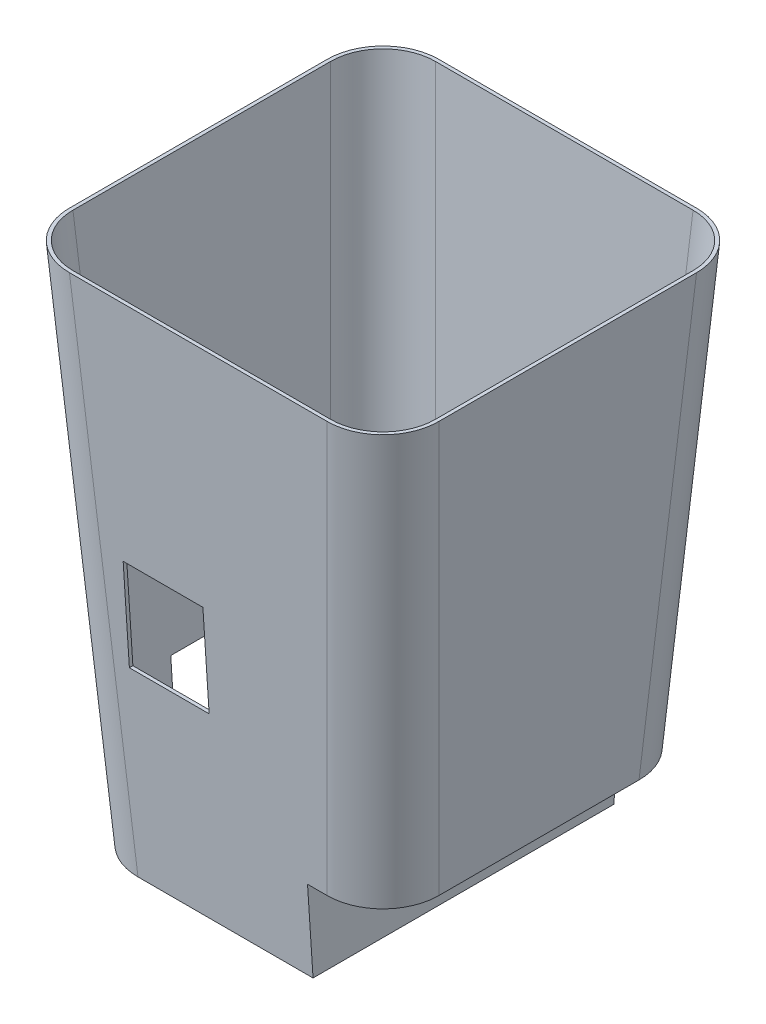
ISO-10303-21;
HEADER;
FILE_DESCRIPTION(('STEP AP214'),'2;1');
FILE_NAME('part.step','',(''),(''),'','','');
FILE_SCHEMA(('AUTOMOTIVE_DESIGN { 1 0 10303 214 1 1 1 1 }'));
ENDSEC;
DATA;
#1=APPLICATION_CONTEXT('core data for automotive mechanical design processes');
#2=APPLICATION_PROTOCOL_DEFINITION('international standard','automotive_design',2000,#1);
#3=PRODUCT_CONTEXT('',#1,'mechanical');
#4=PRODUCT('Part','Part','',(#3));
#5=PRODUCT_RELATED_PRODUCT_CATEGORY('part','',(#4));
#6=PRODUCT_DEFINITION_FORMATION('','',#4);
#7=PRODUCT_DEFINITION_CONTEXT('part definition',#1,'design');
#8=PRODUCT_DEFINITION('design','',#6,#7);
#9=PRODUCT_DEFINITION_SHAPE('','',#8);
#10=(LENGTH_UNIT() NAMED_UNIT(*) SI_UNIT(.MILLI.,.METRE.));
#11=(NAMED_UNIT(*) PLANE_ANGLE_UNIT() SI_UNIT($,.RADIAN.));
#12=(NAMED_UNIT(*) SI_UNIT($,.STERADIAN.) SOLID_ANGLE_UNIT());
#13=UNCERTAINTY_MEASURE_WITH_UNIT(LENGTH_MEASURE(1.E-05),#10,'distance_accuracy_value','');
#14=(GEOMETRIC_REPRESENTATION_CONTEXT(3) GLOBAL_UNCERTAINTY_ASSIGNED_CONTEXT((#13)) GLOBAL_UNIT_ASSIGNED_CONTEXT((#10,
#11,#12)) REPRESENTATION_CONTEXT('',''));
#15=CARTESIAN_POINT('',(0.,0.,0.));
#16=DIRECTION('',(0.,0.,1.));
#17=DIRECTION('',(1.,0.,0.));
#18=AXIS2_PLACEMENT_3D('',#15,#16,#17);
#19=CARTESIAN_POINT('',(0.,-17.8105348768919,271.883267100311));
#20=DIRECTION('',(0.,0.0653679148444921,-0.997861230687355));
#21=DIRECTION('',(0.,0.997861230687355,0.0653679148444922));
#22=AXIS2_PLACEMENT_3D('',#19,#20,#21);
#23=PLANE('',#22);
#24=DIRECTION('',(1.,0.,0.));
#25=VECTOR('',#24,1.);
#26=CARTESIAN_POINT('',(0.,152.4,283.033422459893));
#27=LINE('',#26,#25);
#28=CARTESIAN_POINT('',(146.05,152.4,283.033422459893));
#29=VERTEX_POINT('',#28);
#30=CARTESIAN_POINT('',(181.650721422058,152.4,283.033422459893));
#31=VERTEX_POINT('',#30);
#32=EDGE_CURVE('E544',#29,#31,#27,.T.);
#33=ORIENTED_EDGE('',*,*,#32,.T.);
#34=DIRECTION('',(0.0652287034370434,0.995736125936909,0.0652287034370431));
#35=VECTOR('',#34,1.);
#36=CARTESIAN_POINT('',(169.775123024273,-28.8846449294553,271.157824062108));
#37=LINE('',#36,#35);
#38=CARTESIAN_POINT('',(233.897298962165,949.96,335.28));
#39=VERTEX_POINT('',#38);
#40=EDGE_CURVE('E470',#31,#39,#37,.T.);
#41=ORIENTED_EDGE('',*,*,#40,.T.);
#42=DIRECTION('',(1.,0.,0.));
#43=VECTOR('',#42,1.);
#44=CARTESIAN_POINT('',(335.28,949.96,335.28));
#45=LINE('',#44,#43);
#46=CARTESIAN_POINT('',(-233.897298962165,949.96,335.28));
#47=VERTEX_POINT('',#46);
#48=EDGE_CURVE('E553',#47,#39,#45,.T.);
#49=ORIENTED_EDGE('',*,*,#48,.F.);
#50=DIRECTION('',(-0.0652287034370435,0.995736125936909,0.0652287034370432));
#51=VECTOR('',#50,1.);
#52=CARTESIAN_POINT('',(-169.775123024273,-28.8846449294553,271.157824062108));
#53=LINE('',#52,#51);
#54=CARTESIAN_POINT('',(-171.667298962165,0.,273.05));
#55=VERTEX_POINT('',#54);
#56=EDGE_CURVE('E608',#47,#55,#53,.F.);
#57=ORIENTED_EDGE('',*,*,#56,.T.);
#58=DIRECTION('',(1.,0.,0.));
#59=VECTOR('',#58,1.);
#60=CARTESIAN_POINT('',(273.05,0.,273.05));
#61=LINE('',#60,#59);
#62=CARTESIAN_POINT('',(146.05,0.,273.05));
#63=VERTEX_POINT('',#62);
#64=EDGE_CURVE('E546',#55,#63,#61,.T.);
#65=ORIENTED_EDGE('',*,*,#64,.T.);
#66=DIRECTION('',(0.,0.997861230687355,0.0653679148444922));
#67=VECTOR('',#66,1.);
#68=CARTESIAN_POINT('',(146.05,-17.8105348768919,271.883267100311));
#69=LINE('',#68,#67);
#70=EDGE_CURVE('E643',#63,#29,#69,.T.);
#71=ORIENTED_EDGE('',*,*,#70,.T.);
#72=EDGE_LOOP('',(#33,#41,#49,#57,#65,#71));
#73=FACE_BOUND('',#72,.T.);
#74=DIRECTION('',(0.,-0.997861230687355,-0.0653679148444922));
#75=VECTOR('',#74,1.);
#76=CARTESIAN_POINT('',(-164.7952,-17.810534876892,271.883267100311));
#77=LINE('',#76,#75);
#78=CARTESIAN_POINT('',(-164.7952,516.5725,306.889642379679));
#79=VERTEX_POINT('',#78);
#80=CARTESIAN_POINT('',(-164.7952,343.535,295.554298128342));
#81=VERTEX_POINT('',#80);
#82=EDGE_CURVE('E290',#79,#81,#77,.T.);
#83=ORIENTED_EDGE('',*,*,#82,.F.);
#84=DIRECTION('',(-1.,0.,0.));
#85=VECTOR('',#84,1.);
#86=CARTESIAN_POINT('',(0.,516.5725,306.889642379679));
#87=LINE('',#86,#85);
#88=CARTESIAN_POINT('',(-20.0151999999999,516.5725,306.889642379679));
#89=VERTEX_POINT('',#88);
#90=EDGE_CURVE('E280',#89,#79,#87,.T.);
#91=ORIENTED_EDGE('',*,*,#90,.F.);
#92=DIRECTION('',(0.,0.997861230687355,0.0653679148444922));
#93=VECTOR('',#92,1.);
#94=CARTESIAN_POINT('',(-20.0151999999998,-17.8105348768919,271.883267100311));
#95=LINE('',#94,#93);
#96=CARTESIAN_POINT('',(-20.0151999999999,343.535,295.554298128342));
#97=VERTEX_POINT('',#96);
#98=EDGE_CURVE('E283',#97,#89,#95,.T.);
#99=ORIENTED_EDGE('',*,*,#98,.F.);
#100=DIRECTION('',(1.,0.,0.));
#101=VECTOR('',#100,1.);
#102=CARTESIAN_POINT('',(0.,343.535,295.554298128342));
#103=LINE('',#102,#101);
#104=EDGE_CURVE('E287',#81,#97,#103,.T.);
#105=ORIENTED_EDGE('',*,*,#104,.F.);
#106=EDGE_LOOP('',(#83,#91,#99,#105));
#107=FACE_BOUND('',#106,.T.);
#108=ADVANCED_FACE('F55',(#73,#107),#23,.F.);
#109=CARTESIAN_POINT('',(0.,-17.3954486176294,265.546848285446));
#110=DIRECTION('',(0.,0.0653679148444921,-0.997861230687355));
#111=DIRECTION('',(0.,0.997861230687355,0.0653679148444922));
#112=AXIS2_PLACEMENT_3D('',#109,#110,#111);
#113=PLANE('',#112);
#114=DIRECTION('',(1.,0.,0.));
#115=VECTOR('',#114,1.);
#116=CARTESIAN_POINT('',(0.,158.75,277.085788101307));
#117=LINE('',#116,#115);
#118=CARTESIAN_POINT('',(139.7,158.75,277.085788101307));
#119=VERTEX_POINT('',#118);
#120=CARTESIAN_POINT('',(182.039505878336,158.75,277.085788101307));
#121=VERTEX_POINT('',#120);
#122=EDGE_CURVE('E343',#119,#121,#117,.T.);
#123=ORIENTED_EDGE('',*,*,#122,.F.);
#124=DIRECTION('',(0.,0.997861230687355,0.0653679148444922));
#125=VECTOR('',#124,1.);
#126=CARTESIAN_POINT('',(139.7,-17.3954486176294,265.546848285446));
#127=LINE('',#126,#125);
#128=CARTESIAN_POINT('',(139.7,6.35,267.102365641414));
#129=VERTEX_POINT('',#128);
#130=EDGE_CURVE('E338',#129,#119,#127,.T.);
#131=ORIENTED_EDGE('',*,*,#130,.F.);
#132=DIRECTION('',(1.,0.,0.));
#133=VECTOR('',#132,1.);
#134=CARTESIAN_POINT('',(0.,6.35,267.102365641414));
#135=LINE('',#134,#133);
#136=CARTESIAN_POINT('',(-172.056083418443,6.35,267.102365641414));
#137=VERTEX_POINT('',#136);
#138=EDGE_CURVE('E294',#137,#129,#135,.T.);
#139=ORIENTED_EDGE('',*,*,#138,.F.);
#140=DIRECTION('',(-0.0652287034370435,0.995736125936909,0.0652287034370432));
#141=VECTOR('',#140,1.);
#142=CARTESIAN_POINT('',(-169.775123024273,-28.4695586701928,264.821405247243));
#143=LINE('',#142,#141);
#144=CARTESIAN_POINT('',(-233.870107482614,949.96,328.916389705584));
#145=VERTEX_POINT('',#144);
#146=EDGE_CURVE('E342',#145,#137,#143,.F.);
#147=ORIENTED_EDGE('',*,*,#146,.F.);
#148=DIRECTION('',(1.,0.,0.));
#149=VECTOR('',#148,1.);
#150=CARTESIAN_POINT('',(0.,949.96,328.916389705584));
#151=LINE('',#150,#149);
#152=CARTESIAN_POINT('',(233.870107482614,949.96,328.916389705584));
#153=VERTEX_POINT('',#152);
#154=EDGE_CURVE('E383',#145,#153,#151,.T.);
#155=ORIENTED_EDGE('',*,*,#154,.T.);
#156=DIRECTION('',(0.0652287034370434,0.995736125936909,0.0652287034370431));
#157=VECTOR('',#156,1.);
#158=CARTESIAN_POINT('',(169.775123024273,-28.4695586701928,264.821405247243));
#159=LINE('',#158,#157);
#160=EDGE_CURVE('E348',#121,#153,#159,.T.);
#161=ORIENTED_EDGE('',*,*,#160,.F.);
#162=EDGE_LOOP('',(#123,#131,#139,#147,#155,#161));
#163=FACE_BOUND('',#162,.T.);
#164=DIRECTION('',(-1.,0.,0.));
#165=VECTOR('',#164,1.);
#166=CARTESIAN_POINT('',(0.,516.5725,300.526032085264));
#167=LINE('',#166,#165);
#168=CARTESIAN_POINT('',(-20.0151999999999,516.5725,300.526032085264));
#169=VERTEX_POINT('',#168);
#170=CARTESIAN_POINT('',(-164.7952,516.5725,300.526032085264));
#171=VERTEX_POINT('',#170);
#172=EDGE_CURVE('E965',#169,#171,#167,.T.);
#173=ORIENTED_EDGE('',*,*,#172,.T.);
#174=DIRECTION('',(0.,-0.997861230687355,-0.0653679148444922));
#175=VECTOR('',#174,1.);
#176=CARTESIAN_POINT('',(-164.7952,-17.3954486176294,265.546848285446));
#177=LINE('',#176,#175);
#178=CARTESIAN_POINT('',(-164.7952,343.535,289.190687833927));
#179=VERTEX_POINT('',#178);
#180=EDGE_CURVE('E1002',#171,#179,#177,.T.);
#181=ORIENTED_EDGE('',*,*,#180,.T.);
#182=DIRECTION('',(1.,0.,0.));
#183=VECTOR('',#182,1.);
#184=CARTESIAN_POINT('',(0.,343.535,289.190687833927));
#185=LINE('',#184,#183);
#186=CARTESIAN_POINT('',(-20.0151999999999,343.535,289.190687833927));
#187=VERTEX_POINT('',#186);
#188=EDGE_CURVE('E1007',#179,#187,#185,.T.);
#189=ORIENTED_EDGE('',*,*,#188,.T.);
#190=DIRECTION('',(0.,0.997861230687355,0.0653679148444922));
#191=VECTOR('',#190,1.);
#192=CARTESIAN_POINT('',(-20.0151999999998,-17.3954486176294,265.546848285446));
#193=LINE('',#192,#191);
#194=EDGE_CURVE('E1013',#187,#169,#193,.T.);
#195=ORIENTED_EDGE('',*,*,#194,.T.);
#196=EDGE_LOOP('',(#173,#181,#189,#195));
#197=FACE_BOUND('',#196,.T.);
#198=ADVANCED_FACE('F577',(#163,#197),#113,.T.);
#199=CARTESIAN_POINT('',(0.,949.96,0.));
#200=DIRECTION('',(0.,-1.,0.));
#201=DIRECTION('',(0.,0.,-1.));
#202=AXIS2_PLACEMENT_3D('',#199,#200,#201);
#203=PLANE('',#202);
#204=ORIENTED_EDGE('',*,*,#154,.F.);
#205=CARTESIAN_POINT('',(-233.462235289355,949.96,233.462235289355));
#206=DIRECTION('',(0.,-1.,0.));
#207=DIRECTION('',(-0.707106781186549,0.,0.707106781186546));
#208=AXIS2_PLACEMENT_3D('',#205,#206,#207);
#209=ELLIPSE('',#208,95.6578731241445,95.25);
#210=CARTESIAN_POINT('',(-328.916389705585,949.96,233.870107482614));
#211=VERTEX_POINT('',#210);
#212=EDGE_CURVE('E380',#211,#145,#209,.F.);
#213=ORIENTED_EDGE('',*,*,#212,.F.);
#214=DIRECTION('',(0.,0.,1.));
#215=VECTOR('',#214,1.);
#216=CARTESIAN_POINT('',(-328.916389705585,949.96,0.));
#217=LINE('',#216,#215);
#218=CARTESIAN_POINT('',(-328.916389705585,949.96,-233.870107482614));
#219=VERTEX_POINT('',#218);
#220=EDGE_CURVE('E314',#219,#211,#217,.T.);
#221=ORIENTED_EDGE('',*,*,#220,.F.);
#222=CARTESIAN_POINT('',(-233.462235289355,949.96,-233.462235289355));
#223=DIRECTION('',(0.,-1.,0.));
#224=DIRECTION('',(-0.707106781186547,0.,-0.707106781186549));
#225=AXIS2_PLACEMENT_3D('',#222,#223,#224);
#226=ELLIPSE('',#225,95.6578731241445,95.25);
#227=CARTESIAN_POINT('',(-233.870107482614,949.96,-328.916389705585));
#228=VERTEX_POINT('',#227);
#229=EDGE_CURVE('E351',#228,#219,#226,.F.);
#230=ORIENTED_EDGE('',*,*,#229,.F.);
#231=DIRECTION('',(-1.,0.,0.));
#232=VECTOR('',#231,1.);
#233=CARTESIAN_POINT('',(0.,949.96,-328.916389705585));
#234=LINE('',#233,#232);
#235=CARTESIAN_POINT('',(233.870107482614,949.96,-328.916389705585));
#236=VERTEX_POINT('',#235);
#237=EDGE_CURVE('E347',#236,#228,#234,.T.);
#238=ORIENTED_EDGE('',*,*,#237,.F.);
#239=CARTESIAN_POINT('',(233.462235289355,949.96,-233.462235289355));
#240=DIRECTION('',(0.,-1.,0.));
#241=DIRECTION('',(0.707106781186546,0.,-0.707106781186549));
#242=AXIS2_PLACEMENT_3D('',#239,#240,#241);
#243=ELLIPSE('',#242,95.6578731241445,95.25);
#244=CARTESIAN_POINT('',(328.916389705585,949.96,-233.870107482614));
#245=VERTEX_POINT('',#244);
#246=EDGE_CURVE('E386',#245,#236,#243,.F.);
#247=ORIENTED_EDGE('',*,*,#246,.F.);
#248=DIRECTION('',(0.,0.,-1.));
#249=VECTOR('',#248,1.);
#250=CARTESIAN_POINT('',(328.916389705585,949.96,0.));
#251=LINE('',#250,#249);
#252=CARTESIAN_POINT('',(328.916389705585,949.96,233.870107482614));
#253=VERTEX_POINT('',#252);
#254=EDGE_CURVE('E377',#253,#245,#251,.T.);
#255=ORIENTED_EDGE('',*,*,#254,.F.);
#256=CARTESIAN_POINT('',(233.462235289355,949.96,233.462235289355));
#257=DIRECTION('',(0.,-1.,0.));
#258=DIRECTION('',(0.707106781186549,0.,0.707106781186546));
#259=AXIS2_PLACEMENT_3D('',#256,#257,#258);
#260=ELLIPSE('',#259,95.6578731241445,95.25);
#261=EDGE_CURVE('E368',#153,#253,#260,.F.);
#262=ORIENTED_EDGE('',*,*,#261,.F.);
#263=EDGE_LOOP('',(#204,#213,#221,#230,#238,#247,#255,#262));
#264=FACE_BOUND('',#263,.T.);
#265=ORIENTED_EDGE('',*,*,#48,.T.);
#266=CARTESIAN_POINT('',(233.462235289355,949.96,233.462235289355));
#267=DIRECTION('',(0.,-1.,0.));
#268=DIRECTION('',(0.707106781186549,0.,0.707106781186546));
#269=AXIS2_PLACEMENT_3D('',#266,#267,#268);
#270=ELLIPSE('',#269,102.035064665754,101.6);
#271=CARTESIAN_POINT('',(335.28,949.96,233.897298962164));
#272=VERTEX_POINT('',#271);
#273=EDGE_CURVE('E480',#39,#272,#270,.F.);
#274=ORIENTED_EDGE('',*,*,#273,.T.);
#275=DIRECTION('',(0.,0.,-1.));
#276=VECTOR('',#275,1.);
#277=CARTESIAN_POINT('',(335.28,949.96,-335.28));
#278=LINE('',#277,#276);
#279=CARTESIAN_POINT('',(335.28,949.96,-233.897298962165));
#280=VERTEX_POINT('',#279);
#281=EDGE_CURVE('E545',#272,#280,#278,.T.);
#282=ORIENTED_EDGE('',*,*,#281,.T.);
#283=CARTESIAN_POINT('',(233.462235289355,949.96,-233.462235289355));
#284=DIRECTION('',(0.,-1.,0.));
#285=DIRECTION('',(0.707106781186546,0.,-0.707106781186549));
#286=AXIS2_PLACEMENT_3D('',#283,#284,#285);
#287=ELLIPSE('',#286,102.035064665754,101.6);
#288=CARTESIAN_POINT('',(233.897298962164,949.96,-335.28));
#289=VERTEX_POINT('',#288);
#290=EDGE_CURVE('E475',#280,#289,#287,.F.);
#291=ORIENTED_EDGE('',*,*,#290,.T.);
#292=DIRECTION('',(-1.,0.,0.));
#293=VECTOR('',#292,1.);
#294=CARTESIAN_POINT('',(335.28,949.96,-335.28));
#295=LINE('',#294,#293);
#296=CARTESIAN_POINT('',(-233.897298962165,949.96,-335.28));
#297=VERTEX_POINT('',#296);
#298=EDGE_CURVE('E462',#289,#297,#295,.T.);
#299=ORIENTED_EDGE('',*,*,#298,.T.);
#300=CARTESIAN_POINT('',(-233.462235289355,949.96,-233.462235289355));
#301=DIRECTION('',(0.,-1.,0.));
#302=DIRECTION('',(-0.707106781186547,0.,-0.707106781186549));
#303=AXIS2_PLACEMENT_3D('',#300,#301,#302);
#304=ELLIPSE('',#303,102.035064665754,101.6);
#305=CARTESIAN_POINT('',(-335.28,949.96,-233.897298962165));
#306=VERTEX_POINT('',#305);
#307=EDGE_CURVE('E466',#297,#306,#304,.F.);
#308=ORIENTED_EDGE('',*,*,#307,.T.);
#309=DIRECTION('',(0.,0.,1.));
#310=VECTOR('',#309,1.);
#311=CARTESIAN_POINT('',(-335.28,949.96,-335.28));
#312=LINE('',#311,#310);
#313=CARTESIAN_POINT('',(-335.28,949.96,233.897298962164));
#314=VERTEX_POINT('',#313);
#315=EDGE_CURVE('E548',#306,#314,#312,.T.);
#316=ORIENTED_EDGE('',*,*,#315,.T.);
#317=CARTESIAN_POINT('',(-233.462235289355,949.96,233.462235289355));
#318=DIRECTION('',(0.,-1.,0.));
#319=DIRECTION('',(-0.707106781186549,0.,0.707106781186546));
#320=AXIS2_PLACEMENT_3D('',#317,#318,#319);
#321=ELLIPSE('',#320,102.035064665754,101.6);
#322=EDGE_CURVE('E469',#314,#47,#321,.F.);
#323=ORIENTED_EDGE('',*,*,#322,.T.);
#324=EDGE_LOOP('',(#265,#274,#282,#291,#299,#308,#316,#323));
#325=FACE_BOUND('',#324,.T.);
#326=ADVANCED_FACE('F568',(#264,#325),#203,.F.);
#327=CARTESIAN_POINT('',(0.,0.,0.));
#328=DIRECTION('',(0.,-1.,0.));
#329=DIRECTION('',(0.,0.,-1.));
#330=AXIS2_PLACEMENT_3D('',#327,#328,#329);
#331=PLANE('',#330);
#332=ORIENTED_EDGE('',*,*,#64,.F.);
#333=CARTESIAN_POINT('',(-171.232235289355,0.,171.232235289355));
#334=DIRECTION('',(0.,-1.,0.));
#335=DIRECTION('',(-0.707106781186549,0.,0.707106781186546));
#336=AXIS2_PLACEMENT_3D('',#333,#334,#335);
#337=ELLIPSE('',#336,102.035064665754,101.6);
#338=CARTESIAN_POINT('',(-273.05,0.,171.667298962165));
#339=VERTEX_POINT('',#338);
#340=EDGE_CURVE('E955',#55,#339,#337,.T.);
#341=ORIENTED_EDGE('',*,*,#340,.T.);
#342=DIRECTION('',(0.,0.,1.));
#343=VECTOR('',#342,1.);
#344=CARTESIAN_POINT('',(-273.05,0.,-273.05));
#345=LINE('',#344,#343);
#346=CARTESIAN_POINT('',(-273.05,0.,-171.667298962165));
#347=VERTEX_POINT('',#346);
#348=EDGE_CURVE('E412',#347,#339,#345,.T.);
#349=ORIENTED_EDGE('',*,*,#348,.F.);
#350=CARTESIAN_POINT('',(-171.232235289355,0.,-171.232235289355));
#351=DIRECTION('',(0.,-1.,0.));
#352=DIRECTION('',(-0.707106781186547,0.,-0.707106781186549));
#353=AXIS2_PLACEMENT_3D('',#350,#351,#352);
#354=ELLIPSE('',#353,102.035064665754,101.6);
#355=CARTESIAN_POINT('',(-171.667298962165,0.,-273.05));
#356=VERTEX_POINT('',#355);
#357=EDGE_CURVE('E949',#347,#356,#354,.T.);
#358=ORIENTED_EDGE('',*,*,#357,.T.);
#359=DIRECTION('',(-1.,0.,0.));
#360=VECTOR('',#359,1.);
#361=CARTESIAN_POINT('',(273.05,0.,-273.05));
#362=LINE('',#361,#360);
#363=CARTESIAN_POINT('',(146.05,0.,-273.05));
#364=VERTEX_POINT('',#363);
#365=EDGE_CURVE('E554',#364,#356,#362,.T.);
#366=ORIENTED_EDGE('',*,*,#365,.F.);
#367=DIRECTION('',(0.,0.,1.));
#368=VECTOR('',#367,1.);
#369=CARTESIAN_POINT('',(146.05,0.,-335.2801));
#370=LINE('',#369,#368);
#371=EDGE_CURVE('E401',#364,#63,#370,.T.);
#372=ORIENTED_EDGE('',*,*,#371,.T.);
#373=EDGE_LOOP('',(#332,#341,#349,#358,#366,#372));
#374=FACE_BOUND('',#373,.T.);
#375=ADVANCED_FACE('F435',(#374),#331,.T.);
#376=CARTESIAN_POINT('',(0.,-17.8105348768921,-271.883267100311));
#377=DIRECTION('',(0.,0.0653679148444927,0.997861230687355));
#378=DIRECTION('',(0.,-0.997861230687355,0.0653679148444927));
#379=AXIS2_PLACEMENT_3D('',#376,#377,#378);
#380=PLANE('',#379);
#381=ORIENTED_EDGE('',*,*,#298,.F.);
#382=DIRECTION('',(0.0652287034370434,0.995736125936909,-0.0652287034370437));
#383=VECTOR('',#382,1.);
#384=CARTESIAN_POINT('',(169.775123024273,-28.8846449294554,-271.157824062108));
#385=LINE('',#384,#383);
#386=CARTESIAN_POINT('',(181.650721422058,152.4,-283.033422459893));
#387=VERTEX_POINT('',#386);
#388=EDGE_CURVE('E507',#289,#387,#385,.F.);
#389=ORIENTED_EDGE('',*,*,#388,.T.);
#390=DIRECTION('',(-1.,0.,0.));
#391=VECTOR('',#390,1.);
#392=CARTESIAN_POINT('',(0.,152.4,-283.033422459893));
#393=LINE('',#392,#391);
#394=CARTESIAN_POINT('',(146.05,152.4,-283.033422459893));
#395=VERTEX_POINT('',#394);
#396=EDGE_CURVE('E407',#387,#395,#393,.T.);
#397=ORIENTED_EDGE('',*,*,#396,.T.);
#398=DIRECTION('',(0.,-0.997861230687355,0.0653679148444927));
#399=VECTOR('',#398,1.);
#400=CARTESIAN_POINT('',(146.05,-17.8105348768921,-271.883267100311));
#401=LINE('',#400,#399);
#402=EDGE_CURVE('E408',#395,#364,#401,.T.);
#403=ORIENTED_EDGE('',*,*,#402,.T.);
#404=ORIENTED_EDGE('',*,*,#365,.T.);
#405=DIRECTION('',(-0.0652287034370435,0.995736125936909,-0.0652287034370437));
#406=VECTOR('',#405,1.);
#407=CARTESIAN_POINT('',(-169.775123024273,-28.8846449294555,-271.157824062108));
#408=LINE('',#407,#406);
#409=EDGE_CURVE('E504',#356,#297,#408,.T.);
#410=ORIENTED_EDGE('',*,*,#409,.T.);
#411=EDGE_LOOP('',(#381,#389,#397,#403,#404,#410));
#412=FACE_BOUND('',#411,.T.);
#413=ADVANCED_FACE('F424',(#412),#380,.F.);
#414=CARTESIAN_POINT('',(271.883267100311,-17.810534876892,0.));
#415=DIRECTION('',(-0.997861230687355,0.0653679148444924,0.));
#416=DIRECTION('',(-0.0653679148444924,-0.997861230687355,0.));
#417=AXIS2_PLACEMENT_3D('',#414,#415,#416);
#418=PLANE('',#417);
#419=ORIENTED_EDGE('',*,*,#281,.F.);
#420=DIRECTION('',(0.0652287034370434,0.995736125936909,0.0652287034370431));
#421=VECTOR('',#420,1.);
#422=CARTESIAN_POINT('',(271.157824062108,-28.8846449294553,169.775123024273));
#423=LINE('',#422,#421);
#424=CARTESIAN_POINT('',(283.033422459893,152.4,181.650721422058));
#425=VERTEX_POINT('',#424);
#426=EDGE_CURVE('E491',#272,#425,#423,.F.);
#427=ORIENTED_EDGE('',*,*,#426,.T.);
#428=DIRECTION('',(0.,0.,-1.));
#429=VECTOR('',#428,1.);
#430=CARTESIAN_POINT('',(283.033422459893,152.4,0.));
#431=LINE('',#430,#429);
#432=CARTESIAN_POINT('',(283.033422459893,152.4,-181.650721422058));
#433=VERTEX_POINT('',#432);
#434=EDGE_CURVE('E406',#425,#433,#431,.T.);
#435=ORIENTED_EDGE('',*,*,#434,.T.);
#436=DIRECTION('',(0.0652287034370434,0.995736125936909,-0.0652287034370437));
#437=VECTOR('',#436,1.);
#438=CARTESIAN_POINT('',(271.157824062108,-28.8846449294554,-169.775123024273));
#439=LINE('',#438,#437);
#440=EDGE_CURVE('E485',#433,#280,#439,.T.);
#441=ORIENTED_EDGE('',*,*,#440,.T.);
#442=EDGE_LOOP('',(#419,#427,#435,#441));
#443=FACE_BOUND('',#442,.T.);
#444=ADVANCED_FACE('F434',(#443),#418,.F.);
#445=CARTESIAN_POINT('',(-271.883267100311,-17.810534876892,0.));
#446=DIRECTION('',(0.997861230687355,0.0653679148444925,0.));
#447=DIRECTION('',(-0.0653679148444925,0.997861230687355,0.));
#448=AXIS2_PLACEMENT_3D('',#445,#446,#447);
#449=PLANE('',#448);
#450=DIRECTION('',(0.,0.,1.));
#451=VECTOR('',#450,1.);
#452=CARTESIAN_POINT('',(-286.777205882353,209.55,0.));
#453=LINE('',#452,#451);
#454=CARTESIAN_POINT('',(-286.777205882353,209.55,-104.775));
#455=VERTEX_POINT('',#454);
#456=CARTESIAN_POINT('',(-286.777205882353,209.55,104.775));
#457=VERTEX_POINT('',#456);
#458=EDGE_CURVE('E258',#455,#457,#453,.T.);
#459=ORIENTED_EDGE('',*,*,#458,.T.);
#460=DIRECTION('',(0.0653679148444925,-0.997861230687355,0.));
#461=VECTOR('',#460,1.);
#462=CARTESIAN_POINT('',(-271.883267100311,-17.810534876892,104.775));
#463=LINE('',#462,#461);
#464=CARTESIAN_POINT('',(-273.465975935829,6.34999999999995,104.775));
#465=VERTEX_POINT('',#464);
#466=EDGE_CURVE('E249',#457,#465,#463,.T.);
#467=ORIENTED_EDGE('',*,*,#466,.T.);
#468=DIRECTION('',(0.,0.,-1.));
#469=VECTOR('',#468,1.);
#470=CARTESIAN_POINT('',(-273.465975935829,6.34999999999996,0.));
#471=LINE('',#470,#469);
#472=CARTESIAN_POINT('',(-273.465975935829,6.34999999999996,-104.775));
#473=VERTEX_POINT('',#472);
#474=EDGE_CURVE('E237',#465,#473,#471,.T.);
#475=ORIENTED_EDGE('',*,*,#474,.T.);
#476=DIRECTION('',(-0.0653679148444925,0.997861230687355,0.));
#477=VECTOR('',#476,1.);
#478=CARTESIAN_POINT('',(-271.883267100311,-17.810534876892,-104.775));
#479=LINE('',#478,#477);
#480=EDGE_CURVE('E243',#473,#455,#479,.T.);
#481=ORIENTED_EDGE('',*,*,#480,.T.);
#482=EDGE_LOOP('',(#459,#467,#475,#481));
#483=FACE_BOUND('',#482,.T.);
#484=ORIENTED_EDGE('',*,*,#348,.T.);
#485=DIRECTION('',(-0.0652287034370436,0.995736125936909,0.0652287034370432));
#486=VECTOR('',#485,1.);
#487=CARTESIAN_POINT('',(-271.157824062108,-28.8846449294554,169.775123024273));
#488=LINE('',#487,#486);
#489=EDGE_CURVE('E951',#339,#314,#488,.T.);
#490=ORIENTED_EDGE('',*,*,#489,.T.);
#491=ORIENTED_EDGE('',*,*,#315,.F.);
#492=DIRECTION('',(-0.0652287034370436,0.995736125936909,-0.0652287034370437));
#493=VECTOR('',#492,1.);
#494=CARTESIAN_POINT('',(-271.157824062108,-28.8846449294554,-169.775123024273));
#495=LINE('',#494,#493);
#496=EDGE_CURVE('E512',#306,#347,#495,.F.);
#497=ORIENTED_EDGE('',*,*,#496,.T.);
#498=EDGE_LOOP('',(#484,#490,#491,#497));
#499=FACE_BOUND('',#498,.T.);
#500=ADVANCED_FACE('F256',(#483,#499),#449,.F.);
#501=CARTESIAN_POINT('',(146.05,0.,-335.2801));
#502=DIRECTION('',(-1.,0.,0.));
#503=DIRECTION('',(0.,0.,1.));
#504=AXIS2_PLACEMENT_3D('',#501,#502,#503);
#505=PLANE('',#504);
#506=DIRECTION('',(0.,0.,1.));
#507=VECTOR('',#506,1.);
#508=CARTESIAN_POINT('',(146.05,152.4,-335.2801));
#509=LINE('',#508,#507);
#510=EDGE_CURVE('E303',#395,#29,#509,.T.);
#511=ORIENTED_EDGE('',*,*,#510,.T.);
#512=ORIENTED_EDGE('',*,*,#70,.F.);
#513=ORIENTED_EDGE('',*,*,#371,.F.);
#514=ORIENTED_EDGE('',*,*,#402,.F.);
#515=EDGE_LOOP('',(#511,#512,#513,#514));
#516=FACE_BOUND('',#515,.T.);
#517=ADVANCED_FACE('F670',(#516),#505,.F.);
#518=CARTESIAN_POINT('',(303.740349316418,152.4,-335.2801));
#519=DIRECTION('',(0.,1.,0.));
#520=DIRECTION('',(0.,0.,1.));
#521=AXIS2_PLACEMENT_3D('',#518,#519,#520);
#522=PLANE('',#521);
#523=ORIENTED_EDGE('',*,*,#434,.F.);
#524=CARTESIAN_POINT('',(181.215657749248,152.4,181.215657749248));
#525=DIRECTION('',(0.,1.,0.));
#526=DIRECTION('',(0.707106781186549,0.,0.707106781186546));
#527=AXIS2_PLACEMENT_3D('',#524,#525,#526);
#528=ELLIPSE('',#527,102.035064665754,101.6);
#529=EDGE_CURVE('E501',#425,#31,#528,.F.);
#530=ORIENTED_EDGE('',*,*,#529,.T.);
#531=ORIENTED_EDGE('',*,*,#32,.F.);
#532=ORIENTED_EDGE('',*,*,#510,.F.);
#533=ORIENTED_EDGE('',*,*,#396,.F.);
#534=CARTESIAN_POINT('',(181.215657749248,152.4,-181.215657749248));
#535=DIRECTION('',(0.,1.,0.));
#536=DIRECTION('',(0.707106781186546,0.,-0.707106781186549));
#537=AXIS2_PLACEMENT_3D('',#534,#535,#536);
#538=ELLIPSE('',#537,102.035064665754,101.6);
#539=EDGE_CURVE('E496',#387,#433,#538,.F.);
#540=ORIENTED_EDGE('',*,*,#539,.T.);
#541=EDGE_LOOP('',(#523,#530,#531,#532,#533,#540));
#542=FACE_BOUND('',#541,.T.);
#543=ADVANCED_FACE('F716',(#542),#522,.F.);
#544=CARTESIAN_POINT('',(169.775123024273,-22.2432647812549,169.775123024273));
#545=DIRECTION('',(0.0652287034370434,0.995736125936909,0.0652287034370431));
#546=DIRECTION('',(-0.997861230687355,0.0653679148444924,0.));
#547=AXIS2_PLACEMENT_3D('',#544,#545,#546);
#548=CYLINDRICAL_SURFACE('',#547,101.6);
#549=ORIENTED_EDGE('',*,*,#529,.F.);
#550=ORIENTED_EDGE('',*,*,#426,.F.);
#551=ORIENTED_EDGE('',*,*,#273,.F.);
#552=ORIENTED_EDGE('',*,*,#40,.F.);
#553=EDGE_LOOP('',(#549,#550,#551,#552));
#554=FACE_BOUND('',#553,.T.);
#555=ADVANCED_FACE('F580',(#554),#548,.T.);
#556=CARTESIAN_POINT('',(169.775123024273,-22.243264781255,-169.775123024273));
#557=DIRECTION('',(0.0652287034370434,0.995736125936909,-0.0652287034370437));
#558=DIRECTION('',(0.,0.0653679148444927,0.997861230687355));
#559=AXIS2_PLACEMENT_3D('',#556,#557,#558);
#560=CYLINDRICAL_SURFACE('',#559,101.6);
#561=ORIENTED_EDGE('',*,*,#539,.F.);
#562=ORIENTED_EDGE('',*,*,#388,.F.);
#563=ORIENTED_EDGE('',*,*,#290,.F.);
#564=ORIENTED_EDGE('',*,*,#440,.F.);
#565=EDGE_LOOP('',(#561,#562,#563,#564));
#566=FACE_BOUND('',#565,.T.);
#567=ADVANCED_FACE('F723',(#566),#560,.T.);
#568=CARTESIAN_POINT('',(-169.775123024273,-22.2432647812549,169.775123024273));
#569=DIRECTION('',(-0.0652287034370435,0.995736125936909,0.0652287034370432));
#570=DIRECTION('',(-0.997861230687355,-0.0653679148444925,0.));
#571=AXIS2_PLACEMENT_3D('',#568,#569,#570);
#572=CYLINDRICAL_SURFACE('',#571,101.6);
#573=ORIENTED_EDGE('',*,*,#340,.F.);
#574=ORIENTED_EDGE('',*,*,#56,.F.);
#575=ORIENTED_EDGE('',*,*,#322,.F.);
#576=ORIENTED_EDGE('',*,*,#489,.F.);
#577=EDGE_LOOP('',(#573,#574,#575,#576));
#578=FACE_BOUND('',#577,.T.);
#579=ADVANCED_FACE('F885',(#578),#572,.T.);
#580=CARTESIAN_POINT('',(-169.775123024273,-22.243264781255,-169.775123024273));
#581=DIRECTION('',(-0.0652287034370435,0.995736125936909,-0.0652287034370437));
#582=DIRECTION('',(0.,0.0653679148444927,0.997861230687355));
#583=AXIS2_PLACEMENT_3D('',#580,#581,#582);
#584=CYLINDRICAL_SURFACE('',#583,101.6);
#585=ORIENTED_EDGE('',*,*,#357,.F.);
#586=ORIENTED_EDGE('',*,*,#496,.F.);
#587=ORIENTED_EDGE('',*,*,#307,.F.);
#588=ORIENTED_EDGE('',*,*,#409,.F.);
#589=EDGE_LOOP('',(#585,#586,#587,#588));
#590=FACE_BOUND('',#589,.T.);
#591=ADVANCED_FACE('F57',(#590),#584,.T.);
#592=CARTESIAN_POINT('',(0.,6.35,0.));
#593=DIRECTION('',(0.,-1.,0.));
#594=DIRECTION('',(0.,0.,-1.));
#595=AXIS2_PLACEMENT_3D('',#592,#593,#594);
#596=PLANE('',#595);
#597=DIRECTION('',(1.,0.,0.));
#598=VECTOR('',#597,1.);
#599=CARTESIAN_POINT('',(-679.704,6.34999999999995,104.775));
#600=LINE('',#599,#598);
#601=CARTESIAN_POINT('',(-267.102365641414,6.35,104.775));
#602=VERTEX_POINT('',#601);
#603=EDGE_CURVE('E77',#465,#602,#600,.T.);
#604=ORIENTED_EDGE('',*,*,#603,.T.);
#605=DIRECTION('',(0.,0.,1.));
#606=VECTOR('',#605,1.);
#607=CARTESIAN_POINT('',(-267.102365641414,6.35,0.));
#608=LINE('',#607,#606);
#609=CARTESIAN_POINT('',(-267.102365641413,6.35,172.056083418443));
#610=VERTEX_POINT('',#609);
#611=EDGE_CURVE('E307',#602,#610,#608,.T.);
#612=ORIENTED_EDGE('',*,*,#611,.T.);
#613=CARTESIAN_POINT('',(-171.648211225184,6.35,171.648211225184));
#614=DIRECTION('',(0.,-1.,0.));
#615=DIRECTION('',(-0.707106781186549,0.,0.707106781186546));
#616=AXIS2_PLACEMENT_3D('',#613,#614,#615);
#617=ELLIPSE('',#616,95.6578731241445,95.25);
#618=EDGE_CURVE('E299',#137,#610,#617,.T.);
#619=ORIENTED_EDGE('',*,*,#618,.F.);
#620=ORIENTED_EDGE('',*,*,#138,.T.);
#621=DIRECTION('',(0.,0.,1.));
#622=VECTOR('',#621,1.);
#623=CARTESIAN_POINT('',(139.7,6.35,-335.2801));
#624=LINE('',#623,#622);
#625=CARTESIAN_POINT('',(139.7,6.35,-267.102365641414));
#626=VERTEX_POINT('',#625);
#627=EDGE_CURVE('E315',#626,#129,#624,.T.);
#628=ORIENTED_EDGE('',*,*,#627,.F.);
#629=DIRECTION('',(-1.,0.,0.));
#630=VECTOR('',#629,1.);
#631=CARTESIAN_POINT('',(0.,6.35,-267.102365641414));
#632=LINE('',#631,#630);
#633=CARTESIAN_POINT('',(-172.056083418443,6.35,-267.102365641414));
#634=VERTEX_POINT('',#633);
#635=EDGE_CURVE('E297',#626,#634,#632,.T.);
#636=ORIENTED_EDGE('',*,*,#635,.T.);
#637=CARTESIAN_POINT('',(-171.648211225184,6.35,-171.648211225184));
#638=DIRECTION('',(0.,-1.,0.));
#639=DIRECTION('',(-0.707106781186547,0.,-0.707106781186549));
#640=AXIS2_PLACEMENT_3D('',#637,#638,#639);
#641=ELLIPSE('',#640,95.6578731241445,95.25);
#642=CARTESIAN_POINT('',(-267.102365641414,6.35,-172.056083418443));
#643=VERTEX_POINT('',#642);
#644=EDGE_CURVE('E304',#643,#634,#641,.T.);
#645=ORIENTED_EDGE('',*,*,#644,.F.);
#646=CARTESIAN_POINT('',(-267.102365641414,6.34999999999995,-104.775));
#647=VERTEX_POINT('',#646);
#648=EDGE_CURVE('E298',#643,#647,#608,.T.);
#649=ORIENTED_EDGE('',*,*,#648,.T.);
#650=DIRECTION('',(1.,0.,0.));
#651=VECTOR('',#650,1.);
#652=CARTESIAN_POINT('',(-679.704,6.34999999999995,-104.775));
#653=LINE('',#652,#651);
#654=EDGE_CURVE('E71',#473,#647,#653,.T.);
#655=ORIENTED_EDGE('',*,*,#654,.F.);
#656=ORIENTED_EDGE('',*,*,#474,.F.);
#657=EDGE_LOOP('',(#604,#612,#619,#620,#628,#636,#645,#649,#655,#656));
#658=FACE_BOUND('',#657,.T.);
#659=ADVANCED_FACE('F238',(#658),#596,.F.);
#660=CARTESIAN_POINT('',(0.,-17.3954486176295,-265.546848285446));
#661=DIRECTION('',(0.,0.0653679148444927,0.997861230687355));
#662=DIRECTION('',(0.,-0.997861230687355,0.0653679148444927));
#663=AXIS2_PLACEMENT_3D('',#660,#661,#662);
#664=PLANE('',#663);
#665=ORIENTED_EDGE('',*,*,#237,.T.);
#666=DIRECTION('',(-0.0652287034370435,0.995736125936909,-0.0652287034370437));
#667=VECTOR('',#666,1.);
#668=CARTESIAN_POINT('',(-169.775123024273,-28.4695586701929,-264.821405247243));
#669=LINE('',#668,#667);
#670=EDGE_CURVE('E324',#634,#228,#669,.T.);
#671=ORIENTED_EDGE('',*,*,#670,.F.);
#672=ORIENTED_EDGE('',*,*,#635,.F.);
#673=DIRECTION('',(0.,-0.997861230687355,0.0653679148444927));
#674=VECTOR('',#673,1.);
#675=CARTESIAN_POINT('',(139.7,-17.3954486176295,-265.546848285446));
#676=LINE('',#675,#674);
#677=CARTESIAN_POINT('',(139.7,158.75,-277.085788101307));
#678=VERTEX_POINT('',#677);
#679=EDGE_CURVE('E328',#678,#626,#676,.T.);
#680=ORIENTED_EDGE('',*,*,#679,.F.);
#681=DIRECTION('',(-1.,0.,0.));
#682=VECTOR('',#681,1.);
#683=CARTESIAN_POINT('',(0.,158.75,-277.085788101307));
#684=LINE('',#683,#682);
#685=CARTESIAN_POINT('',(182.039505878336,158.75,-277.085788101307));
#686=VERTEX_POINT('',#685);
#687=EDGE_CURVE('E325',#686,#678,#684,.T.);
#688=ORIENTED_EDGE('',*,*,#687,.F.);
#689=DIRECTION('',(0.0652287034370434,0.995736125936909,-0.0652287034370437));
#690=VECTOR('',#689,1.);
#691=CARTESIAN_POINT('',(169.775123024273,-28.4695586701929,-264.821405247243));
#692=LINE('',#691,#690);
#693=EDGE_CURVE('E320',#236,#686,#692,.F.);
#694=ORIENTED_EDGE('',*,*,#693,.F.);
#695=EDGE_LOOP('',(#665,#671,#672,#680,#688,#694));
#696=FACE_BOUND('',#695,.T.);
#697=ADVANCED_FACE('F752',(#696),#664,.T.);
#698=CARTESIAN_POINT('',(265.546848285446,-17.3954486176294,0.));
#699=DIRECTION('',(-0.997861230687355,0.0653679148444924,0.));
#700=DIRECTION('',(-0.0653679148444924,-0.997861230687355,0.));
#701=AXIS2_PLACEMENT_3D('',#698,#699,#700);
#702=PLANE('',#701);
#703=ORIENTED_EDGE('',*,*,#254,.T.);
#704=DIRECTION('',(0.0652287034370434,0.995736125936909,-0.0652287034370437));
#705=VECTOR('',#704,1.);
#706=CARTESIAN_POINT('',(264.821405247243,-28.4695586701929,-169.775123024273));
#707=LINE('',#706,#705);
#708=CARTESIAN_POINT('',(277.085788101307,158.75,-182.039505878336));
#709=VERTEX_POINT('',#708);
#710=EDGE_CURVE('E365',#709,#245,#707,.T.);
#711=ORIENTED_EDGE('',*,*,#710,.F.);
#712=DIRECTION('',(0.,0.,-1.));
#713=VECTOR('',#712,1.);
#714=CARTESIAN_POINT('',(277.085788101307,158.75,0.));
#715=LINE('',#714,#713);
#716=CARTESIAN_POINT('',(277.085788101307,158.75,182.039505878336));
#717=VERTEX_POINT('',#716);
#718=EDGE_CURVE('E319',#717,#709,#715,.T.);
#719=ORIENTED_EDGE('',*,*,#718,.F.);
#720=DIRECTION('',(0.0652287034370434,0.995736125936909,0.0652287034370431));
#721=VECTOR('',#720,1.);
#722=CARTESIAN_POINT('',(264.821405247243,-28.4695586701928,169.775123024273));
#723=LINE('',#722,#721);
#724=EDGE_CURVE('E362',#253,#717,#723,.F.);
#725=ORIENTED_EDGE('',*,*,#724,.F.);
#726=EDGE_LOOP('',(#703,#711,#719,#725));
#727=FACE_BOUND('',#726,.T.);
#728=ADVANCED_FACE('F761',(#727),#702,.T.);
#729=CARTESIAN_POINT('',(-265.546848285446,-17.3954486176295,0.));
#730=DIRECTION('',(0.997861230687355,0.0653679148444925,0.));
#731=DIRECTION('',(-0.0653679148444925,0.997861230687355,0.));
#732=AXIS2_PLACEMENT_3D('',#729,#730,#731);
#733=PLANE('',#732);
#734=DIRECTION('',(0.0653679148444925,-0.997861230687355,0.));
#735=VECTOR('',#734,1.);
#736=CARTESIAN_POINT('',(-265.546848285446,-17.3954486176295,104.775));
#737=LINE('',#736,#735);
#738=CARTESIAN_POINT('',(-280.413595587938,209.55,104.775));
#739=VERTEX_POINT('',#738);
#740=EDGE_CURVE('E12',#739,#602,#737,.T.);
#741=ORIENTED_EDGE('',*,*,#740,.F.);
#742=DIRECTION('',(0.,0.,1.));
#743=VECTOR('',#742,1.);
#744=CARTESIAN_POINT('',(-280.413595587938,209.55,0.));
#745=LINE('',#744,#743);
#746=CARTESIAN_POINT('',(-280.413595587938,209.55,-104.775));
#747=VERTEX_POINT('',#746);
#748=EDGE_CURVE('E64',#747,#739,#745,.T.);
#749=ORIENTED_EDGE('',*,*,#748,.F.);
#750=DIRECTION('',(-0.0653679148444925,0.997861230687355,0.));
#751=VECTOR('',#750,1.);
#752=CARTESIAN_POINT('',(-265.546848285446,-17.3954486176295,-104.775));
#753=LINE('',#752,#751);
#754=EDGE_CURVE('E998',#647,#747,#753,.T.);
#755=ORIENTED_EDGE('',*,*,#754,.F.);
#756=ORIENTED_EDGE('',*,*,#648,.F.);
#757=DIRECTION('',(-0.0652287034370435,0.995736125936909,-0.0652287034370437));
#758=VECTOR('',#757,1.);
#759=CARTESIAN_POINT('',(-264.821405247243,-28.4695586701929,-169.775123024273));
#760=LINE('',#759,#758);
#761=EDGE_CURVE('E323',#219,#643,#760,.F.);
#762=ORIENTED_EDGE('',*,*,#761,.F.);
#763=ORIENTED_EDGE('',*,*,#220,.T.);
#764=DIRECTION('',(-0.0652287034370435,0.995736125936909,0.0652287034370432));
#765=VECTOR('',#764,1.);
#766=CARTESIAN_POINT('',(-264.821405247243,-28.4695586701928,169.775123024273));
#767=LINE('',#766,#765);
#768=EDGE_CURVE('E310',#610,#211,#767,.T.);
#769=ORIENTED_EDGE('',*,*,#768,.F.);
#770=ORIENTED_EDGE('',*,*,#611,.F.);
#771=EDGE_LOOP('',(#741,#749,#755,#756,#762,#763,#769,#770));
#772=FACE_BOUND('',#771,.T.);
#773=ADVANCED_FACE('F690',(#772),#733,.T.);
#774=CARTESIAN_POINT('',(139.7,0.,-335.2801));
#775=DIRECTION('',(-1.,0.,0.));
#776=DIRECTION('',(0.,0.,1.));
#777=AXIS2_PLACEMENT_3D('',#774,#775,#776);
#778=PLANE('',#777);
#779=DIRECTION('',(0.,0.,1.));
#780=VECTOR('',#779,1.);
#781=CARTESIAN_POINT('',(139.7,158.75,-335.2801));
#782=LINE('',#781,#780);
#783=EDGE_CURVE('E293',#678,#119,#782,.T.);
#784=ORIENTED_EDGE('',*,*,#783,.F.);
#785=ORIENTED_EDGE('',*,*,#679,.T.);
#786=ORIENTED_EDGE('',*,*,#627,.T.);
#787=ORIENTED_EDGE('',*,*,#130,.T.);
#788=EDGE_LOOP('',(#784,#785,#786,#787));
#789=FACE_BOUND('',#788,.T.);
#790=ADVANCED_FACE('F692',(#789),#778,.T.);
#791=CARTESIAN_POINT('',(303.740349316418,158.75,-335.2801));
#792=DIRECTION('',(0.,1.,0.));
#793=DIRECTION('',(0.,0.,1.));
#794=AXIS2_PLACEMENT_3D('',#791,#792,#793);
#795=PLANE('',#794);
#796=ORIENTED_EDGE('',*,*,#718,.T.);
#797=CARTESIAN_POINT('',(181.631633685077,158.75,-181.631633685077));
#798=DIRECTION('',(0.,1.,0.));
#799=DIRECTION('',(0.707106781186546,0.,-0.707106781186549));
#800=AXIS2_PLACEMENT_3D('',#797,#798,#799);
#801=ELLIPSE('',#800,95.6578731241445,95.25);
#802=EDGE_CURVE('E359',#686,#709,#801,.F.);
#803=ORIENTED_EDGE('',*,*,#802,.F.);
#804=ORIENTED_EDGE('',*,*,#687,.T.);
#805=ORIENTED_EDGE('',*,*,#783,.T.);
#806=ORIENTED_EDGE('',*,*,#122,.T.);
#807=CARTESIAN_POINT('',(181.631633685077,158.75,181.631633685077));
#808=DIRECTION('',(0.,1.,0.));
#809=DIRECTION('',(0.707106781186549,0.,0.707106781186546));
#810=AXIS2_PLACEMENT_3D('',#807,#808,#809);
#811=ELLIPSE('',#810,95.6578731241445,95.25);
#812=EDGE_CURVE('E334',#717,#121,#811,.F.);
#813=ORIENTED_EDGE('',*,*,#812,.F.);
#814=EDGE_LOOP('',(#796,#803,#804,#805,#806,#813));
#815=FACE_BOUND('',#814,.T.);
#816=ADVANCED_FACE('F695',(#815),#795,.T.);
#817=CARTESIAN_POINT('',(169.775123024273,-22.2432647812549,169.775123024273));
#818=DIRECTION('',(0.0652287034370434,0.995736125936909,0.0652287034370431));
#819=DIRECTION('',(-0.997861230687355,0.0653679148444924,0.));
#820=AXIS2_PLACEMENT_3D('',#817,#818,#819);
#821=CYLINDRICAL_SURFACE('',#820,95.25);
#822=ORIENTED_EDGE('',*,*,#812,.T.);
#823=ORIENTED_EDGE('',*,*,#160,.T.);
#824=ORIENTED_EDGE('',*,*,#261,.T.);
#825=ORIENTED_EDGE('',*,*,#724,.T.);
#826=EDGE_LOOP('',(#822,#823,#824,#825));
#827=FACE_BOUND('',#826,.T.);
#828=ADVANCED_FACE('F699',(#827),#821,.F.);
#829=CARTESIAN_POINT('',(169.775123024273,-22.243264781255,-169.775123024273));
#830=DIRECTION('',(0.0652287034370434,0.995736125936909,-0.0652287034370437));
#831=DIRECTION('',(0.,0.0653679148444927,0.997861230687355));
#832=AXIS2_PLACEMENT_3D('',#829,#830,#831);
#833=CYLINDRICAL_SURFACE('',#832,95.25);
#834=ORIENTED_EDGE('',*,*,#802,.T.);
#835=ORIENTED_EDGE('',*,*,#710,.T.);
#836=ORIENTED_EDGE('',*,*,#246,.T.);
#837=ORIENTED_EDGE('',*,*,#693,.T.);
#838=EDGE_LOOP('',(#834,#835,#836,#837));
#839=FACE_BOUND('',#838,.T.);
#840=ADVANCED_FACE('F703',(#839),#833,.F.);
#841=CARTESIAN_POINT('',(-169.775123024273,-22.2432647812549,169.775123024273));
#842=DIRECTION('',(-0.0652287034370435,0.995736125936909,0.0652287034370432));
#843=DIRECTION('',(-0.997861230687355,-0.0653679148444925,0.));
#844=AXIS2_PLACEMENT_3D('',#841,#842,#843);
#845=CYLINDRICAL_SURFACE('',#844,95.25);
#846=ORIENTED_EDGE('',*,*,#618,.T.);
#847=ORIENTED_EDGE('',*,*,#768,.T.);
#848=ORIENTED_EDGE('',*,*,#212,.T.);
#849=ORIENTED_EDGE('',*,*,#146,.T.);
#850=EDGE_LOOP('',(#846,#847,#848,#849));
#851=FACE_BOUND('',#850,.T.);
#852=ADVANCED_FACE('F707',(#851),#845,.F.);
#853=CARTESIAN_POINT('',(-169.775123024273,-22.243264781255,-169.775123024273));
#854=DIRECTION('',(-0.0652287034370435,0.995736125936909,-0.0652287034370437));
#855=DIRECTION('',(0.,0.0653679148444927,0.997861230687355));
#856=AXIS2_PLACEMENT_3D('',#853,#854,#855);
#857=CYLINDRICAL_SURFACE('',#856,95.25);
#858=ORIENTED_EDGE('',*,*,#644,.T.);
#859=ORIENTED_EDGE('',*,*,#670,.T.);
#860=ORIENTED_EDGE('',*,*,#229,.T.);
#861=ORIENTED_EDGE('',*,*,#761,.T.);
#862=EDGE_LOOP('',(#858,#859,#860,#861));
#863=FACE_BOUND('',#862,.T.);
#864=ADVANCED_FACE('F711',(#863),#857,.F.);
#865=CARTESIAN_POINT('',(-164.7952,516.5725,431.8));
#866=DIRECTION('',(1.,0.,0.));
#867=DIRECTION('',(0.,1.,0.));
#868=AXIS2_PLACEMENT_3D('',#865,#866,#867);
#869=PLANE('',#868);
#870=ORIENTED_EDGE('',*,*,#82,.T.);
#871=DIRECTION('',(0.,0.,-1.));
#872=VECTOR('',#871,1.);
#873=CARTESIAN_POINT('',(-164.7952,343.535,431.8));
#874=LINE('',#873,#872);
#875=EDGE_CURVE('E276',#81,#179,#874,.T.);
#876=ORIENTED_EDGE('',*,*,#875,.T.);
#877=ORIENTED_EDGE('',*,*,#180,.F.);
#878=DIRECTION('',(0.,0.,-1.));
#879=VECTOR('',#878,1.);
#880=CARTESIAN_POINT('',(-164.7952,516.5725,431.8));
#881=LINE('',#880,#879);
#882=EDGE_CURVE('E260',#79,#171,#881,.T.);
#883=ORIENTED_EDGE('',*,*,#882,.F.);
#884=EDGE_LOOP('',(#870,#876,#877,#883));
#885=FACE_BOUND('',#884,.T.);
#886=ADVANCED_FACE('F714',(#885),#869,.T.);
#887=CARTESIAN_POINT('',(-164.7952,343.535,431.8));
#888=DIRECTION('',(0.,1.,0.));
#889=DIRECTION('',(0.,0.,1.));
#890=AXIS2_PLACEMENT_3D('',#887,#888,#889);
#891=PLANE('',#890);
#892=ORIENTED_EDGE('',*,*,#104,.T.);
#893=DIRECTION('',(0.,0.,-1.));
#894=VECTOR('',#893,1.);
#895=CARTESIAN_POINT('',(-20.0151999999999,343.535,431.8));
#896=LINE('',#895,#894);
#897=EDGE_CURVE('E272',#97,#187,#896,.T.);
#898=ORIENTED_EDGE('',*,*,#897,.T.);
#899=ORIENTED_EDGE('',*,*,#188,.F.);
#900=ORIENTED_EDGE('',*,*,#875,.F.);
#901=EDGE_LOOP('',(#892,#898,#899,#900));
#902=FACE_BOUND('',#901,.T.);
#903=ADVANCED_FACE('F805',(#902),#891,.T.);
#904=CARTESIAN_POINT('',(-20.0151999999999,516.5725,431.8));
#905=DIRECTION('',(-1.,0.,0.));
#906=DIRECTION('',(0.,-1.,0.));
#907=AXIS2_PLACEMENT_3D('',#904,#905,#906);
#908=PLANE('',#907);
#909=ORIENTED_EDGE('',*,*,#98,.T.);
#910=DIRECTION('',(0.,0.,-1.));
#911=VECTOR('',#910,1.);
#912=CARTESIAN_POINT('',(-20.0151999999999,516.5725,431.8));
#913=LINE('',#912,#911);
#914=EDGE_CURVE('E264',#89,#169,#913,.T.);
#915=ORIENTED_EDGE('',*,*,#914,.T.);
#916=ORIENTED_EDGE('',*,*,#194,.F.);
#917=ORIENTED_EDGE('',*,*,#897,.F.);
#918=EDGE_LOOP('',(#909,#915,#916,#917));
#919=FACE_BOUND('',#918,.T.);
#920=ADVANCED_FACE('F797',(#919),#908,.T.);
#921=CARTESIAN_POINT('',(-164.7952,516.5725,431.8));
#922=DIRECTION('',(0.,-1.,0.));
#923=DIRECTION('',(0.,0.,-1.));
#924=AXIS2_PLACEMENT_3D('',#921,#922,#923);
#925=PLANE('',#924);
#926=ORIENTED_EDGE('',*,*,#90,.T.);
#927=ORIENTED_EDGE('',*,*,#882,.T.);
#928=ORIENTED_EDGE('',*,*,#172,.F.);
#929=ORIENTED_EDGE('',*,*,#914,.F.);
#930=EDGE_LOOP('',(#926,#927,#928,#929));
#931=FACE_BOUND('',#930,.T.);
#932=ADVANCED_FACE('F745',(#931),#925,.T.);
#933=CARTESIAN_POINT('',(-679.704,6.34999999999995,104.775));
#934=DIRECTION('',(0.,0.,1.));
#935=DIRECTION('',(1.,0.,0.));
#936=AXIS2_PLACEMENT_3D('',#933,#934,#935);
#937=PLANE('',#936);
#938=DIRECTION('',(1.,0.,0.));
#939=VECTOR('',#938,1.);
#940=CARTESIAN_POINT('',(-679.704,209.55,104.775));
#941=LINE('',#940,#939);
#942=EDGE_CURVE('E244',#457,#739,#941,.T.);
#943=ORIENTED_EDGE('',*,*,#942,.T.);
#944=ORIENTED_EDGE('',*,*,#740,.T.);
#945=ORIENTED_EDGE('',*,*,#603,.F.);
#946=ORIENTED_EDGE('',*,*,#466,.F.);
#947=EDGE_LOOP('',(#943,#944,#945,#946));
#948=FACE_BOUND('',#947,.T.);
#949=ADVANCED_FACE('F248',(#948),#937,.F.);
#950=CARTESIAN_POINT('',(-679.704,209.55,104.775));
#951=DIRECTION('',(0.,1.,0.));
#952=DIRECTION('',(0.,0.,1.));
#953=AXIS2_PLACEMENT_3D('',#950,#951,#952);
#954=PLANE('',#953);
#955=DIRECTION('',(1.,0.,0.));
#956=VECTOR('',#955,1.);
#957=CARTESIAN_POINT('',(-679.704,209.55,-104.775));
#958=LINE('',#957,#956);
#959=EDGE_CURVE('E1027',#455,#747,#958,.T.);
#960=ORIENTED_EDGE('',*,*,#959,.T.);
#961=ORIENTED_EDGE('',*,*,#748,.T.);
#962=ORIENTED_EDGE('',*,*,#942,.F.);
#963=ORIENTED_EDGE('',*,*,#458,.F.);
#964=EDGE_LOOP('',(#960,#961,#962,#963));
#965=FACE_BOUND('',#964,.T.);
#966=ADVANCED_FACE('F770',(#965),#954,.F.);
#967=CARTESIAN_POINT('',(-679.704,6.34999999999995,-104.775));
#968=DIRECTION('',(0.,0.,-1.));
#969=DIRECTION('',(-1.,0.,0.));
#970=AXIS2_PLACEMENT_3D('',#967,#968,#969);
#971=PLANE('',#970);
#972=ORIENTED_EDGE('',*,*,#654,.T.);
#973=ORIENTED_EDGE('',*,*,#754,.T.);
#974=ORIENTED_EDGE('',*,*,#959,.F.);
#975=ORIENTED_EDGE('',*,*,#480,.F.);
#976=EDGE_LOOP('',(#972,#973,#974,#975));
#977=FACE_BOUND('',#976,.T.);
#978=ADVANCED_FACE('F778',(#977),#971,.F.);
#979=CLOSED_SHELL('',(#108,#198,#326,#375,#413,#444,#500,#517,#543,#555,#567,#579,#591,#659,
#697,#728,#773,#790,#816,#828,#840,#852,#864,#886,#903,#920,#932,#949,#966,#978));
#980=MANIFOLD_SOLID_BREP('B2',#979);
#981=ADVANCED_BREP_SHAPE_REPRESENTATION('',(#18,#980),#14);
#982=SHAPE_DEFINITION_REPRESENTATION(#9,#981);
ENDSEC;
END-ISO-10303-21;
